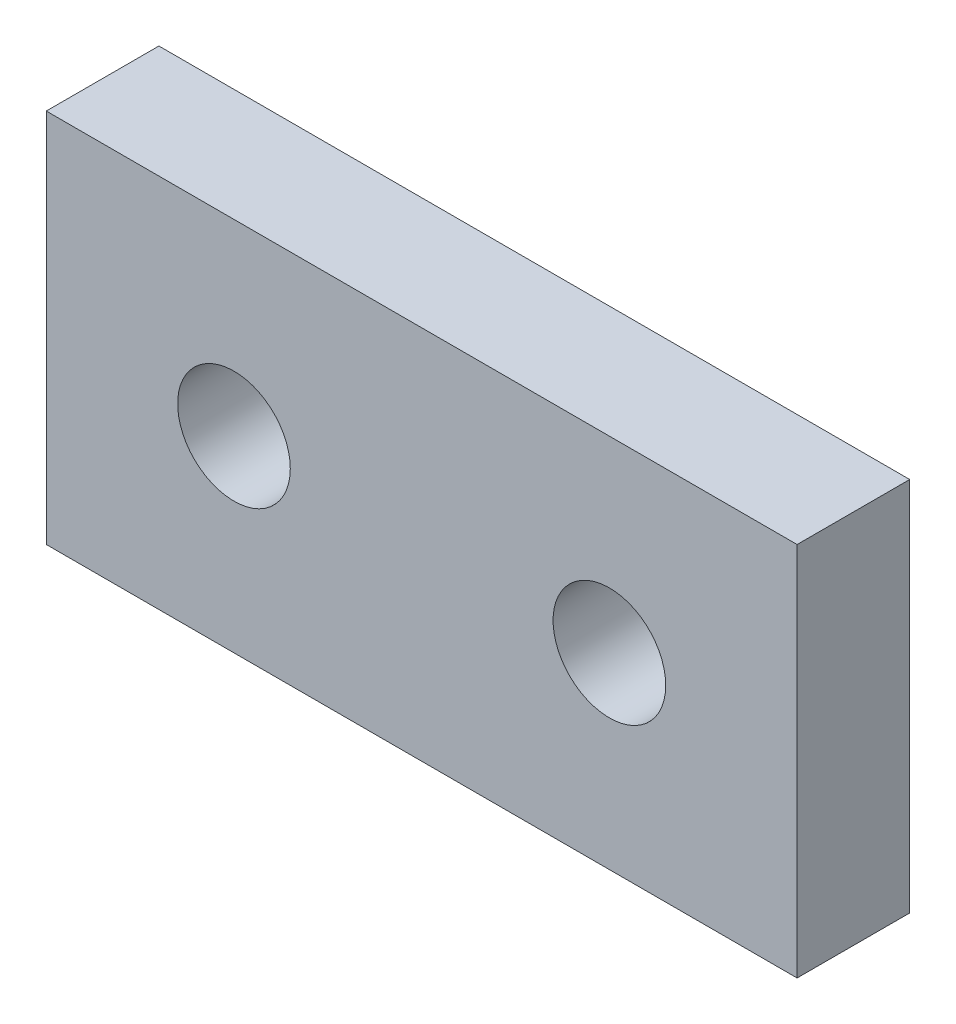
ISO-10303-21;
HEADER;
FILE_DESCRIPTION(('STEP AP214'),'2;1');
FILE_NAME('part.step','',(''),(''),'','','');
FILE_SCHEMA(('AUTOMOTIVE_DESIGN { 1 0 10303 214 1 1 1 1 }'));
ENDSEC;
DATA;
#1=APPLICATION_CONTEXT('core data for automotive mechanical design processes');
#2=APPLICATION_PROTOCOL_DEFINITION('international standard','automotive_design',2000,#1);
#3=PRODUCT_CONTEXT('',#1,'mechanical');
#4=PRODUCT('Part','Part','',(#3));
#5=PRODUCT_RELATED_PRODUCT_CATEGORY('part','',(#4));
#6=PRODUCT_DEFINITION_FORMATION('','',#4);
#7=PRODUCT_DEFINITION_CONTEXT('part definition',#1,'design');
#8=PRODUCT_DEFINITION('design','',#6,#7);
#9=PRODUCT_DEFINITION_SHAPE('','',#8);
#10=(LENGTH_UNIT() NAMED_UNIT(*) SI_UNIT(.MILLI.,.METRE.));
#11=(NAMED_UNIT(*) PLANE_ANGLE_UNIT() SI_UNIT($,.RADIAN.));
#12=(NAMED_UNIT(*) SI_UNIT($,.STERADIAN.) SOLID_ANGLE_UNIT());
#13=UNCERTAINTY_MEASURE_WITH_UNIT(LENGTH_MEASURE(1.E-05),#10,'distance_accuracy_value','');
#14=(GEOMETRIC_REPRESENTATION_CONTEXT(3) GLOBAL_UNCERTAINTY_ASSIGNED_CONTEXT((#13)) GLOBAL_UNIT_ASSIGNED_CONTEXT((#10,
#11,#12)) REPRESENTATION_CONTEXT('',''));
#15=CARTESIAN_POINT('',(0.,0.,0.));
#16=DIRECTION('',(0.,0.,1.));
#17=DIRECTION('',(1.,0.,0.));
#18=AXIS2_PLACEMENT_3D('',#15,#16,#17);
#19=CARTESIAN_POINT('',(0.,0.,3.));
#20=DIRECTION('',(0.,0.,-1.));
#21=DIRECTION('',(-1.,0.,0.));
#22=AXIS2_PLACEMENT_3D('',#19,#20,#21);
#23=PLANE('',#22);
#24=DIRECTION('',(0.,1.,0.));
#25=VECTOR('',#24,1.);
#26=CARTESIAN_POINT('',(10.,-5.,3.));
#27=LINE('',#26,#25);
#28=CARTESIAN_POINT('',(10.,-5.,3.));
#29=VERTEX_POINT('',#28);
#30=CARTESIAN_POINT('',(10.,5.,3.));
#31=VERTEX_POINT('',#30);
#32=EDGE_CURVE('E85',#29,#31,#27,.T.);
#33=ORIENTED_EDGE('',*,*,#32,.T.);
#34=DIRECTION('',(-1.,0.,0.));
#35=VECTOR('',#34,1.);
#36=CARTESIAN_POINT('',(-10.,5.,3.));
#37=LINE('',#36,#35);
#38=CARTESIAN_POINT('',(-10.,5.,3.));
#39=VERTEX_POINT('',#38);
#40=EDGE_CURVE('E80',#31,#39,#37,.T.);
#41=ORIENTED_EDGE('',*,*,#40,.T.);
#42=DIRECTION('',(0.,-1.,0.));
#43=VECTOR('',#42,1.);
#44=CARTESIAN_POINT('',(-10.,-5.,3.));
#45=LINE('',#44,#43);
#46=CARTESIAN_POINT('',(-10.,-5.,3.));
#47=VERTEX_POINT('',#46);
#48=EDGE_CURVE('E83',#39,#47,#45,.T.);
#49=ORIENTED_EDGE('',*,*,#48,.T.);
#50=DIRECTION('',(1.,0.,0.));
#51=VECTOR('',#50,1.);
#52=CARTESIAN_POINT('',(-10.,-5.,3.));
#53=LINE('',#52,#51);
#54=EDGE_CURVE('E50',#47,#29,#53,.T.);
#55=ORIENTED_EDGE('',*,*,#54,.T.);
#56=EDGE_LOOP('',(#33,#41,#49,#55));
#57=FACE_BOUND('',#56,.T.);
#58=CARTESIAN_POINT('',(-5.,0.,3.));
#59=DIRECTION('',(0.,0.,1.));
#60=DIRECTION('',(1.,0.,0.));
#61=AXIS2_PLACEMENT_3D('',#58,#59,#60);
#62=CIRCLE('',#61,1.5);
#63=CARTESIAN_POINT('',(-3.5,0.,3.));
#64=VERTEX_POINT('',#63);
#65=EDGE_CURVE('E100',#64,#64,#62,.T.);
#66=ORIENTED_EDGE('',*,*,#65,.F.);
#67=EDGE_LOOP('',(#66));
#68=FACE_BOUND('',#67,.T.);
#69=CARTESIAN_POINT('',(5.,0.,3.));
#70=DIRECTION('',(0.,0.,1.));
#71=DIRECTION('',(1.,0.,0.));
#72=AXIS2_PLACEMENT_3D('',#69,#70,#71);
#73=CIRCLE('',#72,1.5);
#74=CARTESIAN_POINT('',(6.5,0.,3.));
#75=VERTEX_POINT('',#74);
#76=EDGE_CURVE('E115',#75,#75,#73,.T.);
#77=ORIENTED_EDGE('',*,*,#76,.F.);
#78=EDGE_LOOP('',(#77));
#79=FACE_BOUND('',#78,.T.);
#80=ADVANCED_FACE('F33',(#57,#68,#79),#23,.F.);
#81=CARTESIAN_POINT('',(0.,0.,0.));
#82=DIRECTION('',(0.,0.,-1.));
#83=DIRECTION('',(-1.,0.,0.));
#84=AXIS2_PLACEMENT_3D('',#81,#82,#83);
#85=PLANE('',#84);
#86=CARTESIAN_POINT('',(-5.,0.,0.));
#87=DIRECTION('',(0.,0.,1.));
#88=DIRECTION('',(1.,0.,0.));
#89=AXIS2_PLACEMENT_3D('',#86,#87,#88);
#90=CIRCLE('',#89,1.5);
#91=CARTESIAN_POINT('',(-3.5,0.,0.));
#92=VERTEX_POINT('',#91);
#93=EDGE_CURVE('E112',#92,#92,#90,.T.);
#94=ORIENTED_EDGE('',*,*,#93,.T.);
#95=EDGE_LOOP('',(#94));
#96=FACE_BOUND('',#95,.T.);
#97=DIRECTION('',(0.,1.,0.));
#98=VECTOR('',#97,1.);
#99=CARTESIAN_POINT('',(10.,-5.,0.));
#100=LINE('',#99,#98);
#101=CARTESIAN_POINT('',(10.,-5.,0.));
#102=VERTEX_POINT('',#101);
#103=CARTESIAN_POINT('',(10.,5.,0.));
#104=VERTEX_POINT('',#103);
#105=EDGE_CURVE('E97',#102,#104,#100,.T.);
#106=ORIENTED_EDGE('',*,*,#105,.F.);
#107=DIRECTION('',(1.,0.,0.));
#108=VECTOR('',#107,1.);
#109=CARTESIAN_POINT('',(-10.,-5.,0.));
#110=LINE('',#109,#108);
#111=CARTESIAN_POINT('',(-10.,-5.,0.));
#112=VERTEX_POINT('',#111);
#113=EDGE_CURVE('E73',#112,#102,#110,.T.);
#114=ORIENTED_EDGE('',*,*,#113,.F.);
#115=DIRECTION('',(0.,-1.,0.));
#116=VECTOR('',#115,1.);
#117=CARTESIAN_POINT('',(-10.,-5.,0.));
#118=LINE('',#117,#116);
#119=CARTESIAN_POINT('',(-10.,5.,0.));
#120=VERTEX_POINT('',#119);
#121=EDGE_CURVE('E67',#120,#112,#118,.T.);
#122=ORIENTED_EDGE('',*,*,#121,.F.);
#123=DIRECTION('',(-1.,0.,0.));
#124=VECTOR('',#123,1.);
#125=CARTESIAN_POINT('',(-10.,5.,0.));
#126=LINE('',#125,#124);
#127=EDGE_CURVE('E89',#104,#120,#126,.T.);
#128=ORIENTED_EDGE('',*,*,#127,.F.);
#129=EDGE_LOOP('',(#106,#114,#122,#128));
#130=FACE_BOUND('',#129,.T.);
#131=CARTESIAN_POINT('',(5.,0.,0.));
#132=DIRECTION('',(0.,0.,1.));
#133=DIRECTION('',(1.,0.,0.));
#134=AXIS2_PLACEMENT_3D('',#131,#132,#133);
#135=CIRCLE('',#134,1.5);
#136=CARTESIAN_POINT('',(6.5,0.,0.));
#137=VERTEX_POINT('',#136);
#138=EDGE_CURVE('E118',#137,#137,#135,.T.);
#139=ORIENTED_EDGE('',*,*,#138,.T.);
#140=EDGE_LOOP('',(#139));
#141=FACE_BOUND('',#140,.T.);
#142=ADVANCED_FACE('F108',(#96,#130,#141),#85,.T.);
#143=CARTESIAN_POINT('',(10.,-5.,3.));
#144=DIRECTION('',(-1.,0.,0.));
#145=DIRECTION('',(0.,0.,1.));
#146=AXIS2_PLACEMENT_3D('',#143,#144,#145);
#147=PLANE('',#146);
#148=ORIENTED_EDGE('',*,*,#105,.T.);
#149=DIRECTION('',(0.,0.,-1.));
#150=VECTOR('',#149,1.);
#151=CARTESIAN_POINT('',(10.,5.,3.));
#152=LINE('',#151,#150);
#153=EDGE_CURVE('E11',#31,#104,#152,.T.);
#154=ORIENTED_EDGE('',*,*,#153,.F.);
#155=ORIENTED_EDGE('',*,*,#32,.F.);
#156=DIRECTION('',(0.,0.,-1.));
#157=VECTOR('',#156,1.);
#158=CARTESIAN_POINT('',(10.,-5.,3.));
#159=LINE('',#158,#157);
#160=EDGE_CURVE('E93',#29,#102,#159,.T.);
#161=ORIENTED_EDGE('',*,*,#160,.T.);
#162=EDGE_LOOP('',(#148,#154,#155,#161));
#163=FACE_BOUND('',#162,.T.);
#164=ADVANCED_FACE('F35',(#163),#147,.F.);
#165=CARTESIAN_POINT('',(-10.,5.,3.));
#166=DIRECTION('',(0.,-1.,0.));
#167=DIRECTION('',(0.,0.,-1.));
#168=AXIS2_PLACEMENT_3D('',#165,#166,#167);
#169=PLANE('',#168);
#170=ORIENTED_EDGE('',*,*,#127,.T.);
#171=DIRECTION('',(0.,0.,-1.));
#172=VECTOR('',#171,1.);
#173=CARTESIAN_POINT('',(-10.,5.,3.));
#174=LINE('',#173,#172);
#175=EDGE_CURVE('E42',#39,#120,#174,.T.);
#176=ORIENTED_EDGE('',*,*,#175,.F.);
#177=ORIENTED_EDGE('',*,*,#40,.F.);
#178=ORIENTED_EDGE('',*,*,#153,.T.);
#179=EDGE_LOOP('',(#170,#176,#177,#178));
#180=FACE_BOUND('',#179,.T.);
#181=ADVANCED_FACE('F88',(#180),#169,.F.);
#182=CARTESIAN_POINT('',(-10.,-5.,3.));
#183=DIRECTION('',(1.,0.,0.));
#184=DIRECTION('',(0.,0.,-1.));
#185=AXIS2_PLACEMENT_3D('',#182,#183,#184);
#186=PLANE('',#185);
#187=ORIENTED_EDGE('',*,*,#121,.T.);
#188=DIRECTION('',(0.,0.,-1.));
#189=VECTOR('',#188,1.);
#190=CARTESIAN_POINT('',(-10.,-5.,3.));
#191=LINE('',#190,#189);
#192=EDGE_CURVE('E90',#47,#112,#191,.T.);
#193=ORIENTED_EDGE('',*,*,#192,.F.);
#194=ORIENTED_EDGE('',*,*,#48,.F.);
#195=ORIENTED_EDGE('',*,*,#175,.T.);
#196=EDGE_LOOP('',(#187,#193,#194,#195));
#197=FACE_BOUND('',#196,.T.);
#198=ADVANCED_FACE('F91',(#197),#186,.F.);
#199=CARTESIAN_POINT('',(-10.,-5.,3.));
#200=DIRECTION('',(0.,1.,0.));
#201=DIRECTION('',(0.,0.,1.));
#202=AXIS2_PLACEMENT_3D('',#199,#200,#201);
#203=PLANE('',#202);
#204=ORIENTED_EDGE('',*,*,#113,.T.);
#205=ORIENTED_EDGE('',*,*,#160,.F.);
#206=ORIENTED_EDGE('',*,*,#54,.F.);
#207=ORIENTED_EDGE('',*,*,#192,.T.);
#208=EDGE_LOOP('',(#204,#205,#206,#207));
#209=FACE_BOUND('',#208,.T.);
#210=ADVANCED_FACE('F105',(#209),#203,.F.);
#211=CARTESIAN_POINT('',(-5.,0.,3.));
#212=DIRECTION('',(0.,0.,-1.));
#213=DIRECTION('',(-1.,0.,0.));
#214=AXIS2_PLACEMENT_3D('',#211,#212,#213);
#215=CYLINDRICAL_SURFACE('',#214,1.5);
#216=ORIENTED_EDGE('',*,*,#65,.T.);
#217=EDGE_LOOP('',(#216));
#218=FACE_BOUND('',#217,.T.);
#219=ORIENTED_EDGE('',*,*,#93,.F.);
#220=EDGE_LOOP('',(#219));
#221=FACE_BOUND('',#220,.T.);
#222=ADVANCED_FACE('F135',(#218,#221),#215,.F.);
#223=CARTESIAN_POINT('',(5.,0.,3.));
#224=DIRECTION('',(0.,0.,-1.));
#225=DIRECTION('',(-1.,0.,0.));
#226=AXIS2_PLACEMENT_3D('',#223,#224,#225);
#227=CYLINDRICAL_SURFACE('',#226,1.5);
#228=ORIENTED_EDGE('',*,*,#76,.T.);
#229=EDGE_LOOP('',(#228));
#230=FACE_BOUND('',#229,.T.);
#231=ORIENTED_EDGE('',*,*,#138,.F.);
#232=EDGE_LOOP('',(#231));
#233=FACE_BOUND('',#232,.T.);
#234=ADVANCED_FACE('F124',(#230,#233),#227,.F.);
#235=CLOSED_SHELL('',(#80,#142,#164,#181,#198,#210,#222,#234));
#236=MANIFOLD_SOLID_BREP('B2',#235);
#237=ADVANCED_BREP_SHAPE_REPRESENTATION('',(#18,#236),#14);
#238=SHAPE_DEFINITION_REPRESENTATION(#9,#237);
ENDSEC;
END-ISO-10303-21;
